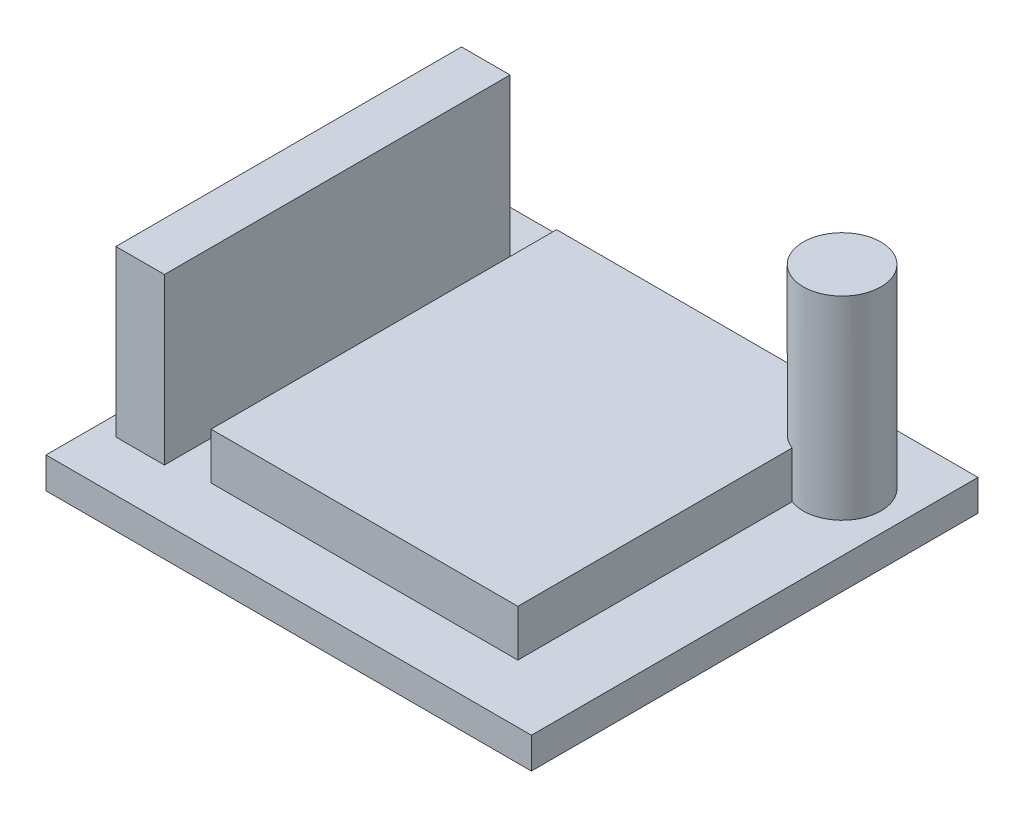
ISO-10303-21;
HEADER;
FILE_DESCRIPTION(('STEP AP214'),'2;1');
FILE_NAME('part.step','',(''),(''),'','','');
FILE_SCHEMA(('AUTOMOTIVE_DESIGN { 1 0 10303 214 1 1 1 1 }'));
ENDSEC;
DATA;
#1=APPLICATION_CONTEXT('core data for automotive mechanical design processes');
#2=APPLICATION_PROTOCOL_DEFINITION('international standard','automotive_design',2000,#1);
#3=PRODUCT_CONTEXT('',#1,'mechanical');
#4=PRODUCT('Part','Part','',(#3));
#5=PRODUCT_RELATED_PRODUCT_CATEGORY('part','',(#4));
#6=PRODUCT_DEFINITION_FORMATION('','',#4);
#7=PRODUCT_DEFINITION_CONTEXT('part definition',#1,'design');
#8=PRODUCT_DEFINITION('design','',#6,#7);
#9=PRODUCT_DEFINITION_SHAPE('','',#8);
#10=(LENGTH_UNIT() NAMED_UNIT(*) SI_UNIT(.MILLI.,.METRE.));
#11=(NAMED_UNIT(*) PLANE_ANGLE_UNIT() SI_UNIT($,.RADIAN.));
#12=(NAMED_UNIT(*) SI_UNIT($,.STERADIAN.) SOLID_ANGLE_UNIT());
#13=UNCERTAINTY_MEASURE_WITH_UNIT(LENGTH_MEASURE(1.E-05),#10,'distance_accuracy_value','');
#14=(GEOMETRIC_REPRESENTATION_CONTEXT(3) GLOBAL_UNCERTAINTY_ASSIGNED_CONTEXT((#13)) GLOBAL_UNIT_ASSIGNED_CONTEXT((#10,
#11,#12)) REPRESENTATION_CONTEXT('',''));
#15=CARTESIAN_POINT('',(0.,0.,0.));
#16=DIRECTION('',(0.,0.,1.));
#17=DIRECTION('',(1.,0.,0.));
#18=AXIS2_PLACEMENT_3D('',#15,#16,#17);
#19=CARTESIAN_POINT('',(0.,0.,0.));
#20=DIRECTION('',(0.,-1.,0.));
#21=DIRECTION('',(0.,0.,-1.));
#22=AXIS2_PLACEMENT_3D('',#19,#20,#21);
#23=PLANE('',#22);
#24=DIRECTION('',(0.,0.,1.));
#25=VECTOR('',#24,1.);
#26=CARTESIAN_POINT('',(0.,0.,0.));
#27=LINE('',#26,#25);
#28=CARTESIAN_POINT('',(0.,0.,-23.));
#29=VERTEX_POINT('',#28);
#30=CARTESIAN_POINT('',(0.,0.,0.));
#31=VERTEX_POINT('',#30);
#32=EDGE_CURVE('E318',#29,#31,#27,.T.);
#33=ORIENTED_EDGE('',*,*,#32,.F.);
#34=DIRECTION('',(-1.,0.,0.));
#35=VECTOR('',#34,1.);
#36=CARTESIAN_POINT('',(0.,0.,-23.));
#37=LINE('',#36,#35);
#38=CARTESIAN_POINT('',(25.,0.,-23.));
#39=VERTEX_POINT('',#38);
#40=EDGE_CURVE('E322',#39,#29,#37,.T.);
#41=ORIENTED_EDGE('',*,*,#40,.F.);
#42=DIRECTION('',(0.,0.,-1.));
#43=VECTOR('',#42,1.);
#44=CARTESIAN_POINT('',(25.,0.,0.));
#45=LINE('',#44,#43);
#46=CARTESIAN_POINT('',(25.,0.,0.));
#47=VERTEX_POINT('',#46);
#48=EDGE_CURVE('E339',#47,#39,#45,.T.);
#49=ORIENTED_EDGE('',*,*,#48,.F.);
#50=DIRECTION('',(1.,0.,0.));
#51=VECTOR('',#50,1.);
#52=CARTESIAN_POINT('',(0.,0.,0.));
#53=LINE('',#52,#51);
#54=EDGE_CURVE('E340',#31,#47,#53,.T.);
#55=ORIENTED_EDGE('',*,*,#54,.F.);
#56=EDGE_LOOP('',(#33,#41,#49,#55));
#57=FACE_BOUND('',#56,.T.);
#58=DIRECTION('',(-1.,0.,0.));
#59=VECTOR('',#58,1.);
#60=CARTESIAN_POINT('',(3.,0.,-19.));
#61=LINE('',#60,#59);
#62=CARTESIAN_POINT('',(22.,0.,-19.));
#63=VERTEX_POINT('',#62);
#64=CARTESIAN_POINT('',(3.,0.,-19.));
#65=VERTEX_POINT('',#64);
#66=EDGE_CURVE('E194',#63,#65,#61,.T.);
#67=ORIENTED_EDGE('',*,*,#66,.T.);
#68=DIRECTION('',(0.,0.,1.));
#69=VECTOR('',#68,1.);
#70=CARTESIAN_POINT('',(3.,0.,-2.));
#71=LINE('',#70,#69);
#72=CARTESIAN_POINT('',(3.,0.,-2.));
#73=VERTEX_POINT('',#72);
#74=EDGE_CURVE('E64',#65,#73,#71,.T.);
#75=ORIENTED_EDGE('',*,*,#74,.T.);
#76=DIRECTION('',(1.,0.,0.));
#77=VECTOR('',#76,1.);
#78=CARTESIAN_POINT('',(3.,0.,-2.));
#79=LINE('',#78,#77);
#80=CARTESIAN_POINT('',(22.,0.,-2.));
#81=VERTEX_POINT('',#80);
#82=EDGE_CURVE('E174',#73,#81,#79,.T.);
#83=ORIENTED_EDGE('',*,*,#82,.T.);
#84=DIRECTION('',(0.,0.,-1.));
#85=VECTOR('',#84,1.);
#86=CARTESIAN_POINT('',(22.,0.,-2.));
#87=LINE('',#86,#85);
#88=EDGE_CURVE('E200',#81,#63,#87,.T.);
#89=ORIENTED_EDGE('',*,*,#88,.T.);
#90=EDGE_LOOP('',(#67,#75,#83,#89));
#91=FACE_BOUND('',#90,.T.);
#92=ADVANCED_FACE('F47',(#57,#91),#23,.T.);
#93=CARTESIAN_POINT('',(21.3,4.,-3.));
#94=DIRECTION('',(-1.,0.,0.));
#95=DIRECTION('',(0.,0.,1.));
#96=AXIS2_PLACEMENT_3D('',#93,#94,#95);
#97=PLANE('',#96);
#98=DIRECTION('',(0.,-1.,0.));
#99=VECTOR('',#98,1.);
#100=CARTESIAN_POINT('',(21.3,11.6,-17.1265006004805));
#101=LINE('',#100,#99);
#102=CARTESIAN_POINT('',(21.3,4.,-17.1265006004805));
#103=VERTEX_POINT('',#102);
#104=CARTESIAN_POINT('',(21.3,1.6,-17.1265006004805));
#105=VERTEX_POINT('',#104);
#106=EDGE_CURVE('E229',#103,#105,#101,.T.);
#107=ORIENTED_EDGE('',*,*,#106,.F.);
#108=DIRECTION('',(0.,0.,-1.));
#109=VECTOR('',#108,1.);
#110=CARTESIAN_POINT('',(21.3,4.,-3.));
#111=LINE('',#110,#109);
#112=CARTESIAN_POINT('',(21.3,4.,-3.));
#113=VERTEX_POINT('',#112);
#114=EDGE_CURVE('E287',#113,#103,#111,.T.);
#115=ORIENTED_EDGE('',*,*,#114,.F.);
#116=DIRECTION('',(0.,-1.,0.));
#117=VECTOR('',#116,1.);
#118=CARTESIAN_POINT('',(21.3,4.,-3.));
#119=LINE('',#118,#117);
#120=CARTESIAN_POINT('',(21.3,1.6,-3.));
#121=VERTEX_POINT('',#120);
#122=EDGE_CURVE('E309',#113,#121,#119,.T.);
#123=ORIENTED_EDGE('',*,*,#122,.T.);
#124=DIRECTION('',(0.,0.,-1.));
#125=VECTOR('',#124,1.);
#126=CARTESIAN_POINT('',(21.3,1.6,-3.));
#127=LINE('',#126,#125);
#128=EDGE_CURVE('E305',#121,#105,#127,.T.);
#129=ORIENTED_EDGE('',*,*,#128,.T.);
#130=EDGE_LOOP('',(#107,#115,#123,#129));
#131=FACE_BOUND('',#130,.T.);
#132=ADVANCED_FACE('F408',(#131),#97,.F.);
#133=CARTESIAN_POINT('',(5.5,4.,-20.8));
#134=DIRECTION('',(0.,0.,1.));
#135=DIRECTION('',(1.,0.,0.));
#136=AXIS2_PLACEMENT_3D('',#133,#134,#135);
#137=PLANE('',#136);
#138=DIRECTION('',(0.,-1.,0.));
#139=VECTOR('',#138,1.);
#140=CARTESIAN_POINT('',(21.1282202112919,11.6,-20.8));
#141=LINE('',#140,#139);
#142=CARTESIAN_POINT('',(21.1282202112919,1.6,-20.8));
#143=VERTEX_POINT('',#142);
#144=CARTESIAN_POINT('',(21.1282202112919,4.,-20.8));
#145=VERTEX_POINT('',#144);
#146=EDGE_CURVE('E221',#143,#145,#141,.F.);
#147=ORIENTED_EDGE('',*,*,#146,.F.);
#148=DIRECTION('',(-1.,0.,0.));
#149=VECTOR('',#148,1.);
#150=CARTESIAN_POINT('',(5.5,1.6,-20.8));
#151=LINE('',#150,#149);
#152=CARTESIAN_POINT('',(5.5,1.6,-20.8));
#153=VERTEX_POINT('',#152);
#154=EDGE_CURVE('E284',#143,#153,#151,.T.);
#155=ORIENTED_EDGE('',*,*,#154,.T.);
#156=DIRECTION('',(0.,-1.,0.));
#157=VECTOR('',#156,1.);
#158=CARTESIAN_POINT('',(5.5,4.,-20.8));
#159=LINE('',#158,#157);
#160=CARTESIAN_POINT('',(5.5,4.,-20.8));
#161=VERTEX_POINT('',#160);
#162=EDGE_CURVE('E294',#161,#153,#159,.T.);
#163=ORIENTED_EDGE('',*,*,#162,.F.);
#164=DIRECTION('',(-1.,0.,0.));
#165=VECTOR('',#164,1.);
#166=CARTESIAN_POINT('',(5.5,4.,-20.8));
#167=LINE('',#166,#165);
#168=EDGE_CURVE('E292',#145,#161,#167,.T.);
#169=ORIENTED_EDGE('',*,*,#168,.F.);
#170=EDGE_LOOP('',(#147,#155,#163,#169));
#171=FACE_BOUND('',#170,.T.);
#172=ADVANCED_FACE('F379',(#171),#137,.F.);
#173=CARTESIAN_POINT('',(0.,1.6,0.));
#174=DIRECTION('',(0.,-1.,0.));
#175=DIRECTION('',(0.,0.,-1.));
#176=AXIS2_PLACEMENT_3D('',#173,#174,#175);
#177=PLANE('',#176);
#178=CARTESIAN_POINT('',(22.,1.6,-19.));
#179=DIRECTION('',(0.,1.,0.));
#180=DIRECTION('',(0.,0.,1.));
#181=AXIS2_PLACEMENT_3D('',#178,#179,#180);
#182=CIRCLE('',#181,2.);
#183=EDGE_CURVE('E71',#105,#143,#182,.T.);
#184=ORIENTED_EDGE('',*,*,#183,.F.);
#185=ORIENTED_EDGE('',*,*,#128,.F.);
#186=DIRECTION('',(1.,0.,0.));
#187=VECTOR('',#186,1.);
#188=CARTESIAN_POINT('',(5.5,1.6,-3.));
#189=LINE('',#188,#187);
#190=CARTESIAN_POINT('',(5.5,1.6,-3.));
#191=VERTEX_POINT('',#190);
#192=EDGE_CURVE('E297',#191,#121,#189,.T.);
#193=ORIENTED_EDGE('',*,*,#192,.F.);
#194=DIRECTION('',(0.,0.,1.));
#195=VECTOR('',#194,1.);
#196=CARTESIAN_POINT('',(5.5,1.6,-3.));
#197=LINE('',#196,#195);
#198=EDGE_CURVE('E276',#153,#191,#197,.T.);
#199=ORIENTED_EDGE('',*,*,#198,.F.);
#200=ORIENTED_EDGE('',*,*,#154,.F.);
#201=EDGE_LOOP('',(#184,#185,#193,#199,#200));
#202=FACE_BOUND('',#201,.T.);
#203=DIRECTION('',(0.,0.,1.));
#204=VECTOR('',#203,1.);
#205=CARTESIAN_POINT('',(0.,1.6,0.));
#206=LINE('',#205,#204);
#207=CARTESIAN_POINT('',(0.,1.6,-23.));
#208=VERTEX_POINT('',#207);
#209=CARTESIAN_POINT('',(0.,1.6,0.));
#210=VERTEX_POINT('',#209);
#211=EDGE_CURVE('E317',#208,#210,#206,.T.);
#212=ORIENTED_EDGE('',*,*,#211,.T.);
#213=DIRECTION('',(1.,0.,0.));
#214=VECTOR('',#213,1.);
#215=CARTESIAN_POINT('',(0.,1.6,0.));
#216=LINE('',#215,#214);
#217=CARTESIAN_POINT('',(25.,1.6,0.));
#218=VERTEX_POINT('',#217);
#219=EDGE_CURVE('E323',#210,#218,#216,.T.);
#220=ORIENTED_EDGE('',*,*,#219,.T.);
#221=DIRECTION('',(0.,0.,-1.));
#222=VECTOR('',#221,1.);
#223=CARTESIAN_POINT('',(25.,1.6,0.));
#224=LINE('',#223,#222);
#225=CARTESIAN_POINT('',(25.,1.6,-23.));
#226=VERTEX_POINT('',#225);
#227=EDGE_CURVE('E330',#218,#226,#224,.T.);
#228=ORIENTED_EDGE('',*,*,#227,.T.);
#229=DIRECTION('',(-1.,0.,0.));
#230=VECTOR('',#229,1.);
#231=CARTESIAN_POINT('',(0.,1.6,-23.));
#232=LINE('',#231,#230);
#233=EDGE_CURVE('E329',#226,#208,#232,.T.);
#234=ORIENTED_EDGE('',*,*,#233,.T.);
#235=EDGE_LOOP('',(#212,#220,#228,#234));
#236=FACE_BOUND('',#235,.T.);
#237=DIRECTION('',(0.,0.,1.));
#238=VECTOR('',#237,1.);
#239=CARTESIAN_POINT('',(1.,1.6,-2.6));
#240=LINE('',#239,#238);
#241=CARTESIAN_POINT('',(1.,1.6,-20.4));
#242=VERTEX_POINT('',#241);
#243=CARTESIAN_POINT('',(1.,1.6,-2.6));
#244=VERTEX_POINT('',#243);
#245=EDGE_CURVE('E233',#242,#244,#240,.T.);
#246=ORIENTED_EDGE('',*,*,#245,.F.);
#247=DIRECTION('',(-1.,0.,0.));
#248=VECTOR('',#247,1.);
#249=CARTESIAN_POINT('',(1.,1.6,-20.4));
#250=LINE('',#249,#248);
#251=CARTESIAN_POINT('',(3.5,1.6,-20.4));
#252=VERTEX_POINT('',#251);
#253=EDGE_CURVE('E238',#252,#242,#250,.T.);
#254=ORIENTED_EDGE('',*,*,#253,.F.);
#255=DIRECTION('',(0.,0.,-1.));
#256=VECTOR('',#255,1.);
#257=CARTESIAN_POINT('',(3.5,1.6,-2.6));
#258=LINE('',#257,#256);
#259=CARTESIAN_POINT('',(3.5,1.6,-2.6));
#260=VERTEX_POINT('',#259);
#261=EDGE_CURVE('E260',#260,#252,#258,.T.);
#262=ORIENTED_EDGE('',*,*,#261,.F.);
#263=DIRECTION('',(1.,0.,0.));
#264=VECTOR('',#263,1.);
#265=CARTESIAN_POINT('',(1.,1.6,-2.6));
#266=LINE('',#265,#264);
#267=EDGE_CURVE('E251',#244,#260,#266,.T.);
#268=ORIENTED_EDGE('',*,*,#267,.F.);
#269=EDGE_LOOP('',(#246,#254,#262,#268));
#270=FACE_BOUND('',#269,.T.);
#271=ADVANCED_FACE('F380',(#202,#236,#270),#177,.F.);
#272=CARTESIAN_POINT('',(0.,1.6,0.));
#273=DIRECTION('',(1.,0.,0.));
#274=DIRECTION('',(0.,0.,-1.));
#275=AXIS2_PLACEMENT_3D('',#272,#273,#274);
#276=PLANE('',#275);
#277=ORIENTED_EDGE('',*,*,#32,.T.);
#278=DIRECTION('',(0.,-1.,0.));
#279=VECTOR('',#278,1.);
#280=CARTESIAN_POINT('',(0.,1.6,0.));
#281=LINE('',#280,#279);
#282=EDGE_CURVE('E59',#210,#31,#281,.T.);
#283=ORIENTED_EDGE('',*,*,#282,.F.);
#284=ORIENTED_EDGE('',*,*,#211,.F.);
#285=DIRECTION('',(0.,-1.,0.));
#286=VECTOR('',#285,1.);
#287=CARTESIAN_POINT('',(0.,1.6,-23.));
#288=LINE('',#287,#286);
#289=EDGE_CURVE('E334',#208,#29,#288,.T.);
#290=ORIENTED_EDGE('',*,*,#289,.T.);
#291=EDGE_LOOP('',(#277,#283,#284,#290));
#292=FACE_BOUND('',#291,.T.);
#293=ADVANCED_FACE('F51',(#292),#276,.F.);
#294=CARTESIAN_POINT('',(0.,1.6,0.));
#295=DIRECTION('',(0.,0.,-1.));
#296=DIRECTION('',(-1.,0.,0.));
#297=AXIS2_PLACEMENT_3D('',#294,#295,#296);
#298=PLANE('',#297);
#299=ORIENTED_EDGE('',*,*,#54,.T.);
#300=DIRECTION('',(0.,-1.,0.));
#301=VECTOR('',#300,1.);
#302=CARTESIAN_POINT('',(25.,1.6,0.));
#303=LINE('',#302,#301);
#304=EDGE_CURVE('E355',#218,#47,#303,.T.);
#305=ORIENTED_EDGE('',*,*,#304,.F.);
#306=ORIENTED_EDGE('',*,*,#219,.F.);
#307=ORIENTED_EDGE('',*,*,#282,.T.);
#308=EDGE_LOOP('',(#299,#305,#306,#307));
#309=FACE_BOUND('',#308,.T.);
#310=ADVANCED_FACE('F358',(#309),#298,.F.);
#311=CARTESIAN_POINT('',(25.,1.6,0.));
#312=DIRECTION('',(-1.,0.,0.));
#313=DIRECTION('',(0.,0.,1.));
#314=AXIS2_PLACEMENT_3D('',#311,#312,#313);
#315=PLANE('',#314);
#316=ORIENTED_EDGE('',*,*,#48,.T.);
#317=DIRECTION('',(0.,-1.,0.));
#318=VECTOR('',#317,1.);
#319=CARTESIAN_POINT('',(25.,1.6,-23.));
#320=LINE('',#319,#318);
#321=EDGE_CURVE('E346',#226,#39,#320,.T.);
#322=ORIENTED_EDGE('',*,*,#321,.F.);
#323=ORIENTED_EDGE('',*,*,#227,.F.);
#324=ORIENTED_EDGE('',*,*,#304,.T.);
#325=EDGE_LOOP('',(#316,#322,#323,#324));
#326=FACE_BOUND('',#325,.T.);
#327=ADVANCED_FACE('F371',(#326),#315,.F.);
#328=CARTESIAN_POINT('',(0.,1.6,-23.));
#329=DIRECTION('',(0.,0.,1.));
#330=DIRECTION('',(1.,0.,0.));
#331=AXIS2_PLACEMENT_3D('',#328,#329,#330);
#332=PLANE('',#331);
#333=ORIENTED_EDGE('',*,*,#40,.T.);
#334=ORIENTED_EDGE('',*,*,#289,.F.);
#335=ORIENTED_EDGE('',*,*,#233,.F.);
#336=ORIENTED_EDGE('',*,*,#321,.T.);
#337=EDGE_LOOP('',(#333,#334,#335,#336));
#338=FACE_BOUND('',#337,.T.);
#339=ADVANCED_FACE('F374',(#338),#332,.F.);
#340=CARTESIAN_POINT('',(5.5,4.,-3.));
#341=DIRECTION('',(1.,0.,0.));
#342=DIRECTION('',(0.,0.,-1.));
#343=AXIS2_PLACEMENT_3D('',#340,#341,#342);
#344=PLANE('',#343);
#345=ORIENTED_EDGE('',*,*,#198,.T.);
#346=DIRECTION('',(0.,-1.,0.));
#347=VECTOR('',#346,1.);
#348=CARTESIAN_POINT('',(5.5,4.,-3.));
#349=LINE('',#348,#347);
#350=CARTESIAN_POINT('',(5.5,4.,-3.));
#351=VERTEX_POINT('',#350);
#352=EDGE_CURVE('E314',#351,#191,#349,.T.);
#353=ORIENTED_EDGE('',*,*,#352,.F.);
#354=DIRECTION('',(0.,0.,1.));
#355=VECTOR('',#354,1.);
#356=CARTESIAN_POINT('',(5.5,4.,-3.));
#357=LINE('',#356,#355);
#358=EDGE_CURVE('E278',#161,#351,#357,.T.);
#359=ORIENTED_EDGE('',*,*,#358,.F.);
#360=ORIENTED_EDGE('',*,*,#162,.T.);
#361=EDGE_LOOP('',(#345,#353,#359,#360));
#362=FACE_BOUND('',#361,.T.);
#363=ADVANCED_FACE('F419',(#362),#344,.F.);
#364=CARTESIAN_POINT('',(5.5,4.,-3.));
#365=DIRECTION('',(0.,0.,-1.));
#366=DIRECTION('',(-1.,0.,0.));
#367=AXIS2_PLACEMENT_3D('',#364,#365,#366);
#368=PLANE('',#367);
#369=ORIENTED_EDGE('',*,*,#192,.T.);
#370=ORIENTED_EDGE('',*,*,#122,.F.);
#371=DIRECTION('',(1.,0.,0.));
#372=VECTOR('',#371,1.);
#373=CARTESIAN_POINT('',(5.5,4.,-3.));
#374=LINE('',#373,#372);
#375=EDGE_CURVE('E283',#351,#113,#374,.T.);
#376=ORIENTED_EDGE('',*,*,#375,.F.);
#377=ORIENTED_EDGE('',*,*,#352,.T.);
#378=EDGE_LOOP('',(#369,#370,#376,#377));
#379=FACE_BOUND('',#378,.T.);
#380=ADVANCED_FACE('F564',(#379),#368,.F.);
#381=CARTESIAN_POINT('',(0.,4.,0.));
#382=DIRECTION('',(0.,-1.,0.));
#383=DIRECTION('',(0.,0.,-1.));
#384=AXIS2_PLACEMENT_3D('',#381,#382,#383);
#385=PLANE('',#384);
#386=CARTESIAN_POINT('',(22.,4.,-19.));
#387=DIRECTION('',(0.,-1.,0.));
#388=DIRECTION('',(0.,0.,-1.));
#389=AXIS2_PLACEMENT_3D('',#386,#387,#388);
#390=CIRCLE('',#389,2.);
#391=EDGE_CURVE('E11',#145,#103,#390,.F.);
#392=ORIENTED_EDGE('',*,*,#391,.F.);
#393=ORIENTED_EDGE('',*,*,#168,.T.);
#394=ORIENTED_EDGE('',*,*,#358,.T.);
#395=ORIENTED_EDGE('',*,*,#375,.T.);
#396=ORIENTED_EDGE('',*,*,#114,.T.);
#397=EDGE_LOOP('',(#392,#393,#394,#395,#396));
#398=FACE_BOUND('',#397,.T.);
#399=ADVANCED_FACE('F406',(#398),#385,.F.);
#400=CARTESIAN_POINT('',(1.,10.1,-2.6));
#401=DIRECTION('',(1.,0.,0.));
#402=DIRECTION('',(0.,0.,-1.));
#403=AXIS2_PLACEMENT_3D('',#400,#401,#402);
#404=PLANE('',#403);
#405=ORIENTED_EDGE('',*,*,#245,.T.);
#406=DIRECTION('',(0.,-1.,0.));
#407=VECTOR('',#406,1.);
#408=CARTESIAN_POINT('',(1.,10.1,-2.6));
#409=LINE('',#408,#407);
#410=CARTESIAN_POINT('',(1.,10.1,-2.6));
#411=VERTEX_POINT('',#410);
#412=EDGE_CURVE('E274',#411,#244,#409,.T.);
#413=ORIENTED_EDGE('',*,*,#412,.F.);
#414=DIRECTION('',(0.,0.,1.));
#415=VECTOR('',#414,1.);
#416=CARTESIAN_POINT('',(1.,10.1,-2.6));
#417=LINE('',#416,#415);
#418=CARTESIAN_POINT('',(1.,10.1,-20.4));
#419=VERTEX_POINT('',#418);
#420=EDGE_CURVE('E234',#419,#411,#417,.T.);
#421=ORIENTED_EDGE('',*,*,#420,.F.);
#422=DIRECTION('',(0.,-1.,0.));
#423=VECTOR('',#422,1.);
#424=CARTESIAN_POINT('',(1.,10.1,-20.4));
#425=LINE('',#424,#423);
#426=EDGE_CURVE('E248',#419,#242,#425,.T.);
#427=ORIENTED_EDGE('',*,*,#426,.T.);
#428=EDGE_LOOP('',(#405,#413,#421,#427));
#429=FACE_BOUND('',#428,.T.);
#430=ADVANCED_FACE('F388',(#429),#404,.F.);
#431=CARTESIAN_POINT('',(1.,10.1,-2.6));
#432=DIRECTION('',(0.,0.,-1.));
#433=DIRECTION('',(-1.,0.,0.));
#434=AXIS2_PLACEMENT_3D('',#431,#432,#433);
#435=PLANE('',#434);
#436=ORIENTED_EDGE('',*,*,#267,.T.);
#437=DIRECTION('',(0.,-1.,0.));
#438=VECTOR('',#437,1.);
#439=CARTESIAN_POINT('',(3.5,10.1,-2.6));
#440=LINE('',#439,#438);
#441=CARTESIAN_POINT('',(3.5,10.1,-2.6));
#442=VERTEX_POINT('',#441);
#443=EDGE_CURVE('E271',#442,#260,#440,.T.);
#444=ORIENTED_EDGE('',*,*,#443,.F.);
#445=DIRECTION('',(1.,0.,0.));
#446=VECTOR('',#445,1.);
#447=CARTESIAN_POINT('',(1.,10.1,-2.6));
#448=LINE('',#447,#446);
#449=EDGE_CURVE('E239',#411,#442,#448,.T.);
#450=ORIENTED_EDGE('',*,*,#449,.F.);
#451=ORIENTED_EDGE('',*,*,#412,.T.);
#452=EDGE_LOOP('',(#436,#444,#450,#451));
#453=FACE_BOUND('',#452,.T.);
#454=ADVANCED_FACE('F397',(#453),#435,.F.);
#455=CARTESIAN_POINT('',(3.5,10.1,-2.6));
#456=DIRECTION('',(-1.,0.,0.));
#457=DIRECTION('',(0.,0.,1.));
#458=AXIS2_PLACEMENT_3D('',#455,#456,#457);
#459=PLANE('',#458);
#460=ORIENTED_EDGE('',*,*,#261,.T.);
#461=DIRECTION('',(0.,-1.,0.));
#462=VECTOR('',#461,1.);
#463=CARTESIAN_POINT('',(3.5,10.1,-20.4));
#464=LINE('',#463,#462);
#465=CARTESIAN_POINT('',(3.5,10.1,-20.4));
#466=VERTEX_POINT('',#465);
#467=EDGE_CURVE('E270',#466,#252,#464,.T.);
#468=ORIENTED_EDGE('',*,*,#467,.F.);
#469=DIRECTION('',(0.,0.,-1.));
#470=VECTOR('',#469,1.);
#471=CARTESIAN_POINT('',(3.5,10.1,-2.6));
#472=LINE('',#471,#470);
#473=EDGE_CURVE('E242',#442,#466,#472,.T.);
#474=ORIENTED_EDGE('',*,*,#473,.F.);
#475=ORIENTED_EDGE('',*,*,#443,.T.);
#476=EDGE_LOOP('',(#460,#468,#474,#475));
#477=FACE_BOUND('',#476,.T.);
#478=ADVANCED_FACE('F396',(#477),#459,.F.);
#479=CARTESIAN_POINT('',(1.,10.1,-20.4));
#480=DIRECTION('',(0.,0.,1.));
#481=DIRECTION('',(1.,0.,0.));
#482=AXIS2_PLACEMENT_3D('',#479,#480,#481);
#483=PLANE('',#482);
#484=ORIENTED_EDGE('',*,*,#253,.T.);
#485=ORIENTED_EDGE('',*,*,#426,.F.);
#486=DIRECTION('',(-1.,0.,0.));
#487=VECTOR('',#486,1.);
#488=CARTESIAN_POINT('',(1.,10.1,-20.4));
#489=LINE('',#488,#487);
#490=EDGE_CURVE('E246',#466,#419,#489,.T.);
#491=ORIENTED_EDGE('',*,*,#490,.F.);
#492=ORIENTED_EDGE('',*,*,#467,.T.);
#493=EDGE_LOOP('',(#484,#485,#491,#492));
#494=FACE_BOUND('',#493,.T.);
#495=ADVANCED_FACE('F387',(#494),#483,.F.);
#496=CARTESIAN_POINT('',(0.,10.1,0.));
#497=DIRECTION('',(0.,-1.,0.));
#498=DIRECTION('',(0.,0.,-1.));
#499=AXIS2_PLACEMENT_3D('',#496,#497,#498);
#500=PLANE('',#499);
#501=ORIENTED_EDGE('',*,*,#420,.T.);
#502=ORIENTED_EDGE('',*,*,#449,.T.);
#503=ORIENTED_EDGE('',*,*,#473,.T.);
#504=ORIENTED_EDGE('',*,*,#490,.T.);
#505=EDGE_LOOP('',(#501,#502,#503,#504));
#506=FACE_BOUND('',#505,.T.);
#507=ADVANCED_FACE('F395',(#506),#500,.F.);
#508=CARTESIAN_POINT('',(22.,11.6,-19.));
#509=DIRECTION('',(0.,-1.,0.));
#510=DIRECTION('',(0.,0.,-1.));
#511=AXIS2_PLACEMENT_3D('',#508,#509,#510);
#512=CYLINDRICAL_SURFACE('',#511,2.);
#513=CARTESIAN_POINT('',(22.,11.6,-19.));
#514=DIRECTION('',(0.,1.,0.));
#515=DIRECTION('',(0.,0.,1.));
#516=AXIS2_PLACEMENT_3D('',#513,#514,#515);
#517=CIRCLE('',#516,2.);
#518=CARTESIAN_POINT('',(22.,11.6,-17.));
#519=VERTEX_POINT('',#518);
#520=EDGE_CURVE('E219',#519,#519,#517,.T.);
#521=ORIENTED_EDGE('',*,*,#520,.F.);
#522=EDGE_LOOP('',(#521));
#523=FACE_BOUND('',#522,.T.);
#524=ORIENTED_EDGE('',*,*,#391,.T.);
#525=ORIENTED_EDGE('',*,*,#106,.T.);
#526=ORIENTED_EDGE('',*,*,#183,.T.);
#527=ORIENTED_EDGE('',*,*,#146,.T.);
#528=EDGE_LOOP('',(#524,#525,#526,#527));
#529=FACE_BOUND('',#528,.T.);
#530=ADVANCED_FACE('F522',(#523,#529),#512,.T.);
#531=CARTESIAN_POINT('',(22.,11.6,-19.));
#532=DIRECTION('',(0.,1.,0.));
#533=DIRECTION('',(0.,0.,1.));
#534=AXIS2_PLACEMENT_3D('',#531,#532,#533);
#535=PLANE('',#534);
#536=ORIENTED_EDGE('',*,*,#520,.T.);
#537=EDGE_LOOP('',(#536));
#538=FACE_BOUND('',#537,.T.);
#539=ADVANCED_FACE('F456',(#538),#535,.T.);
#540=CARTESIAN_POINT('',(3.,-2.,-2.));
#541=DIRECTION('',(-1.,0.,0.));
#542=DIRECTION('',(0.,0.,1.));
#543=AXIS2_PLACEMENT_3D('',#540,#541,#542);
#544=PLANE('',#543);
#545=ORIENTED_EDGE('',*,*,#74,.F.);
#546=DIRECTION('',(0.,1.,0.));
#547=VECTOR('',#546,1.);
#548=CARTESIAN_POINT('',(3.,-2.,-19.));
#549=LINE('',#548,#547);
#550=CARTESIAN_POINT('',(3.,-2.,-19.));
#551=VERTEX_POINT('',#550);
#552=EDGE_CURVE('E192',#551,#65,#549,.T.);
#553=ORIENTED_EDGE('',*,*,#552,.F.);
#554=DIRECTION('',(0.,0.,1.));
#555=VECTOR('',#554,1.);
#556=CARTESIAN_POINT('',(3.,-2.,-2.));
#557=LINE('',#556,#555);
#558=CARTESIAN_POINT('',(3.,-2.,-2.));
#559=VERTEX_POINT('',#558);
#560=EDGE_CURVE('E186',#551,#559,#557,.T.);
#561=ORIENTED_EDGE('',*,*,#560,.T.);
#562=DIRECTION('',(0.,1.,0.));
#563=VECTOR('',#562,1.);
#564=CARTESIAN_POINT('',(3.,-2.,-2.));
#565=LINE('',#564,#563);
#566=EDGE_CURVE('E168',#559,#73,#565,.T.);
#567=ORIENTED_EDGE('',*,*,#566,.T.);
#568=EDGE_LOOP('',(#545,#553,#561,#567));
#569=FACE_BOUND('',#568,.T.);
#570=ADVANCED_FACE('F195',(#569),#544,.T.);
#571=CARTESIAN_POINT('',(3.,-2.,-19.));
#572=DIRECTION('',(0.,0.,-1.));
#573=DIRECTION('',(-1.,0.,0.));
#574=AXIS2_PLACEMENT_3D('',#571,#572,#573);
#575=PLANE('',#574);
#576=ORIENTED_EDGE('',*,*,#66,.F.);
#577=DIRECTION('',(0.,1.,0.));
#578=VECTOR('',#577,1.);
#579=CARTESIAN_POINT('',(22.,-2.,-19.));
#580=LINE('',#579,#578);
#581=CARTESIAN_POINT('',(22.,-2.,-19.));
#582=VERTEX_POINT('',#581);
#583=EDGE_CURVE('E214',#582,#63,#580,.T.);
#584=ORIENTED_EDGE('',*,*,#583,.F.);
#585=DIRECTION('',(-1.,0.,0.));
#586=VECTOR('',#585,1.);
#587=CARTESIAN_POINT('',(3.,-2.,-19.));
#588=LINE('',#587,#586);
#589=EDGE_CURVE('E178',#582,#551,#588,.T.);
#590=ORIENTED_EDGE('',*,*,#589,.T.);
#591=ORIENTED_EDGE('',*,*,#552,.T.);
#592=EDGE_LOOP('',(#576,#584,#590,#591));
#593=FACE_BOUND('',#592,.T.);
#594=ADVANCED_FACE('F467',(#593),#575,.T.);
#595=CARTESIAN_POINT('',(22.,-2.,-2.));
#596=DIRECTION('',(1.,0.,0.));
#597=DIRECTION('',(0.,0.,-1.));
#598=AXIS2_PLACEMENT_3D('',#595,#596,#597);
#599=PLANE('',#598);
#600=ORIENTED_EDGE('',*,*,#88,.F.);
#601=DIRECTION('',(0.,1.,0.));
#602=VECTOR('',#601,1.);
#603=CARTESIAN_POINT('',(22.,-2.,-2.));
#604=LINE('',#603,#602);
#605=CARTESIAN_POINT('',(22.,-2.,-2.));
#606=VERTEX_POINT('',#605);
#607=EDGE_CURVE('E177',#606,#81,#604,.T.);
#608=ORIENTED_EDGE('',*,*,#607,.F.);
#609=DIRECTION('',(0.,0.,-1.));
#610=VECTOR('',#609,1.);
#611=CARTESIAN_POINT('',(22.,-2.,-2.));
#612=LINE('',#611,#610);
#613=EDGE_CURVE('E188',#606,#582,#612,.T.);
#614=ORIENTED_EDGE('',*,*,#613,.T.);
#615=ORIENTED_EDGE('',*,*,#583,.T.);
#616=EDGE_LOOP('',(#600,#608,#614,#615));
#617=FACE_BOUND('',#616,.T.);
#618=ADVANCED_FACE('F476',(#617),#599,.T.);
#619=CARTESIAN_POINT('',(3.,-2.,-2.));
#620=DIRECTION('',(0.,0.,1.));
#621=DIRECTION('',(1.,0.,0.));
#622=AXIS2_PLACEMENT_3D('',#619,#620,#621);
#623=PLANE('',#622);
#624=ORIENTED_EDGE('',*,*,#82,.F.);
#625=ORIENTED_EDGE('',*,*,#566,.F.);
#626=DIRECTION('',(1.,0.,0.));
#627=VECTOR('',#626,1.);
#628=CARTESIAN_POINT('',(3.,-2.,-2.));
#629=LINE('',#628,#627);
#630=EDGE_CURVE('E172',#559,#606,#629,.T.);
#631=ORIENTED_EDGE('',*,*,#630,.T.);
#632=ORIENTED_EDGE('',*,*,#607,.T.);
#633=EDGE_LOOP('',(#624,#625,#631,#632));
#634=FACE_BOUND('',#633,.T.);
#635=ADVANCED_FACE('F175',(#634),#623,.T.);
#636=CARTESIAN_POINT('',(0.,-2.,0.));
#637=DIRECTION('',(0.,-1.,0.));
#638=DIRECTION('',(0.,0.,-1.));
#639=AXIS2_PLACEMENT_3D('',#636,#637,#638);
#640=PLANE('',#639);
#641=ORIENTED_EDGE('',*,*,#560,.F.);
#642=ORIENTED_EDGE('',*,*,#589,.F.);
#643=ORIENTED_EDGE('',*,*,#613,.F.);
#644=ORIENTED_EDGE('',*,*,#630,.F.);
#645=EDGE_LOOP('',(#641,#642,#643,#644));
#646=FACE_BOUND('',#645,.T.);
#647=ADVANCED_FACE('F184',(#646),#640,.T.);
#648=CLOSED_SHELL('',(#92,#132,#172,#271,#293,#310,#327,#339,#363,#380,#399,#430,#454,#478,#495,
#507,#530,#539,#570,#594,#618,#635,#647));
#649=MANIFOLD_SOLID_BREP('B2',#648);
#650=ADVANCED_BREP_SHAPE_REPRESENTATION('',(#18,#649),#14);
#651=SHAPE_DEFINITION_REPRESENTATION(#9,#650);
ENDSEC;
END-ISO-10303-21;
